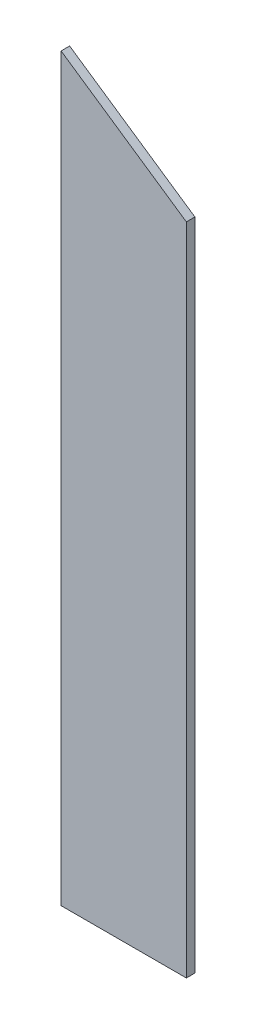
ISO-10303-21;
HEADER;
FILE_DESCRIPTION(('STEP AP214'),'2;1');
FILE_NAME('part.step','',(''),(''),'','','');
FILE_SCHEMA(('AUTOMOTIVE_DESIGN { 1 0 10303 214 1 1 1 1 }'));
ENDSEC;
DATA;
#1=APPLICATION_CONTEXT('core data for automotive mechanical design processes');
#2=APPLICATION_PROTOCOL_DEFINITION('international standard','automotive_design',2000,#1);
#3=PRODUCT_CONTEXT('',#1,'mechanical');
#4=PRODUCT('Part','Part','',(#3));
#5=PRODUCT_RELATED_PRODUCT_CATEGORY('part','',(#4));
#6=PRODUCT_DEFINITION_FORMATION('','',#4);
#7=PRODUCT_DEFINITION_CONTEXT('part definition',#1,'design');
#8=PRODUCT_DEFINITION('design','',#6,#7);
#9=PRODUCT_DEFINITION_SHAPE('','',#8);
#10=(LENGTH_UNIT() NAMED_UNIT(*) SI_UNIT(.MILLI.,.METRE.));
#11=(NAMED_UNIT(*) PLANE_ANGLE_UNIT() SI_UNIT($,.RADIAN.));
#12=(NAMED_UNIT(*) SI_UNIT($,.STERADIAN.) SOLID_ANGLE_UNIT());
#13=UNCERTAINTY_MEASURE_WITH_UNIT(LENGTH_MEASURE(1.E-05),#10,'distance_accuracy_value','');
#14=(GEOMETRIC_REPRESENTATION_CONTEXT(3) GLOBAL_UNCERTAINTY_ASSIGNED_CONTEXT((#13)) GLOBAL_UNIT_ASSIGNED_CONTEXT((#10,
#11,#12)) REPRESENTATION_CONTEXT('',''));
#15=CARTESIAN_POINT('',(0.,0.,0.));
#16=DIRECTION('',(0.,0.,1.));
#17=DIRECTION('',(1.,0.,0.));
#18=AXIS2_PLACEMENT_3D('',#15,#16,#17);
#19=CARTESIAN_POINT('',(110.,500.,15.));
#20=DIRECTION('',(-1.,0.,0.));
#21=DIRECTION('',(0.,-1.,0.));
#22=AXIS2_PLACEMENT_3D('',#19,#20,#21);
#23=PLANE('',#22);
#24=DIRECTION('',(0.,1.,0.));
#25=VECTOR('',#24,1.);
#26=CARTESIAN_POINT('',(110.,500.,0.));
#27=LINE('',#26,#25);
#28=CARTESIAN_POINT('',(110.,-650.,0.));
#29=VERTEX_POINT('',#28);
#30=CARTESIAN_POINT('',(110.,500.,0.));
#31=VERTEX_POINT('',#30);
#32=EDGE_CURVE('E107',#29,#31,#27,.T.);
#33=ORIENTED_EDGE('',*,*,#32,.T.);
#34=DIRECTION('',(0.,0.,-1.));
#35=VECTOR('',#34,1.);
#36=CARTESIAN_POINT('',(110.,500.,15.));
#37=LINE('',#36,#35);
#38=CARTESIAN_POINT('',(110.,500.,15.));
#39=VERTEX_POINT('',#38);
#40=EDGE_CURVE('E11',#39,#31,#37,.T.);
#41=ORIENTED_EDGE('',*,*,#40,.F.);
#42=DIRECTION('',(0.,1.,0.));
#43=VECTOR('',#42,1.);
#44=CARTESIAN_POINT('',(110.,500.,15.));
#45=LINE('',#44,#43);
#46=CARTESIAN_POINT('',(110.,-650.,15.));
#47=VERTEX_POINT('',#46);
#48=EDGE_CURVE('E91',#47,#39,#45,.T.);
#49=ORIENTED_EDGE('',*,*,#48,.F.);
#50=DIRECTION('',(0.,0.,-1.));
#51=VECTOR('',#50,1.);
#52=CARTESIAN_POINT('',(110.,-650.,15.));
#53=LINE('',#52,#51);
#54=EDGE_CURVE('E103',#47,#29,#53,.T.);
#55=ORIENTED_EDGE('',*,*,#54,.T.);
#56=EDGE_LOOP('',(#33,#41,#49,#55));
#57=FACE_BOUND('',#56,.T.);
#58=ADVANCED_FACE('F39',(#57),#23,.F.);
#59=CARTESIAN_POINT('',(110.,500.,15.));
#60=DIRECTION('',(-0.563336824641509,-0.826227342807548,0.));
#61=DIRECTION('',(0.826227342807548,-0.56333682464151,0.));
#62=AXIS2_PLACEMENT_3D('',#59,#60,#61);
#63=PLANE('',#62);
#64=DIRECTION('',(-0.826227342807548,0.563336824641509,0.));
#65=VECTOR('',#64,1.);
#66=CARTESIAN_POINT('',(110.,500.,0.));
#67=LINE('',#66,#65);
#68=CARTESIAN_POINT('',(-110.,649.999999999999,0.));
#69=VERTEX_POINT('',#68);
#70=EDGE_CURVE('E96',#31,#69,#67,.T.);
#71=ORIENTED_EDGE('',*,*,#70,.T.);
#72=DIRECTION('',(0.,0.,-1.));
#73=VECTOR('',#72,1.);
#74=CARTESIAN_POINT('',(-110.,649.999999999999,15.));
#75=LINE('',#74,#73);
#76=CARTESIAN_POINT('',(-110.,649.999999999999,15.));
#77=VERTEX_POINT('',#76);
#78=EDGE_CURVE('E48',#77,#69,#75,.T.);
#79=ORIENTED_EDGE('',*,*,#78,.F.);
#80=DIRECTION('',(-0.826227342807548,0.563336824641509,0.));
#81=VECTOR('',#80,1.);
#82=CARTESIAN_POINT('',(110.,500.,15.));
#83=LINE('',#82,#81);
#84=EDGE_CURVE('E86',#39,#77,#83,.T.);
#85=ORIENTED_EDGE('',*,*,#84,.F.);
#86=ORIENTED_EDGE('',*,*,#40,.T.);
#87=EDGE_LOOP('',(#71,#79,#85,#86));
#88=FACE_BOUND('',#87,.T.);
#89=ADVANCED_FACE('F95',(#88),#63,.F.);
#90=CARTESIAN_POINT('',(-110.,649.999999999999,15.));
#91=DIRECTION('',(1.,0.,0.));
#92=DIRECTION('',(0.,1.,0.));
#93=AXIS2_PLACEMENT_3D('',#90,#91,#92);
#94=PLANE('',#93);
#95=DIRECTION('',(0.,-1.,0.));
#96=VECTOR('',#95,1.);
#97=CARTESIAN_POINT('',(-110.,649.999999999999,0.));
#98=LINE('',#97,#96);
#99=CARTESIAN_POINT('',(-110.,-650.,0.));
#100=VERTEX_POINT('',#99);
#101=EDGE_CURVE('E73',#69,#100,#98,.T.);
#102=ORIENTED_EDGE('',*,*,#101,.T.);
#103=DIRECTION('',(0.,0.,-1.));
#104=VECTOR('',#103,1.);
#105=CARTESIAN_POINT('',(-110.,-650.,15.));
#106=LINE('',#105,#104);
#107=CARTESIAN_POINT('',(-110.,-650.,15.));
#108=VERTEX_POINT('',#107);
#109=EDGE_CURVE('E98',#108,#100,#106,.T.);
#110=ORIENTED_EDGE('',*,*,#109,.F.);
#111=DIRECTION('',(0.,-1.,0.));
#112=VECTOR('',#111,1.);
#113=CARTESIAN_POINT('',(-110.,649.999999999999,15.));
#114=LINE('',#113,#112);
#115=EDGE_CURVE('E89',#77,#108,#114,.T.);
#116=ORIENTED_EDGE('',*,*,#115,.F.);
#117=ORIENTED_EDGE('',*,*,#78,.T.);
#118=EDGE_LOOP('',(#102,#110,#116,#117));
#119=FACE_BOUND('',#118,.T.);
#120=ADVANCED_FACE('F99',(#119),#94,.F.);
#121=CARTESIAN_POINT('',(-110.,-650.,15.));
#122=DIRECTION('',(0.,1.,0.));
#123=DIRECTION('',(0.,0.,1.));
#124=AXIS2_PLACEMENT_3D('',#121,#122,#123);
#125=PLANE('',#124);
#126=DIRECTION('',(1.,0.,0.));
#127=VECTOR('',#126,1.);
#128=CARTESIAN_POINT('',(-110.,-650.,0.));
#129=LINE('',#128,#127);
#130=EDGE_CURVE('E79',#100,#29,#129,.T.);
#131=ORIENTED_EDGE('',*,*,#130,.T.);
#132=ORIENTED_EDGE('',*,*,#54,.F.);
#133=DIRECTION('',(1.,0.,0.));
#134=VECTOR('',#133,1.);
#135=CARTESIAN_POINT('',(-110.,-650.,15.));
#136=LINE('',#135,#134);
#137=EDGE_CURVE('E56',#108,#47,#136,.T.);
#138=ORIENTED_EDGE('',*,*,#137,.F.);
#139=ORIENTED_EDGE('',*,*,#109,.T.);
#140=EDGE_LOOP('',(#131,#132,#138,#139));
#141=FACE_BOUND('',#140,.T.);
#142=ADVANCED_FACE('F120',(#141),#125,.F.);
#143=CARTESIAN_POINT('',(0.,0.,15.));
#144=DIRECTION('',(0.,0.,1.));
#145=DIRECTION('',(1.,0.,0.));
#146=AXIS2_PLACEMENT_3D('',#143,#144,#145);
#147=PLANE('',#146);
#148=ORIENTED_EDGE('',*,*,#48,.T.);
#149=ORIENTED_EDGE('',*,*,#84,.T.);
#150=ORIENTED_EDGE('',*,*,#115,.T.);
#151=ORIENTED_EDGE('',*,*,#137,.T.);
#152=EDGE_LOOP('',(#148,#149,#150,#151));
#153=FACE_BOUND('',#152,.T.);
#154=ADVANCED_FACE('F87',(#153),#147,.T.);
#155=CARTESIAN_POINT('',(0.,0.,0.));
#156=DIRECTION('',(0.,0.,1.));
#157=DIRECTION('',(1.,0.,0.));
#158=AXIS2_PLACEMENT_3D('',#155,#156,#157);
#159=PLANE('',#158);
#160=ORIENTED_EDGE('',*,*,#32,.F.);
#161=ORIENTED_EDGE('',*,*,#130,.F.);
#162=ORIENTED_EDGE('',*,*,#101,.F.);
#163=ORIENTED_EDGE('',*,*,#70,.F.);
#164=EDGE_LOOP('',(#160,#161,#162,#163));
#165=FACE_BOUND('',#164,.T.);
#166=ADVANCED_FACE('F123',(#165),#159,.F.);
#167=CLOSED_SHELL('',(#58,#89,#120,#142,#154,#166));
#168=MANIFOLD_SOLID_BREP('B2',#167);
#169=ADVANCED_BREP_SHAPE_REPRESENTATION('',(#18,#168),#14);
#170=SHAPE_DEFINITION_REPRESENTATION(#9,#169);
ENDSEC;
END-ISO-10303-21;
